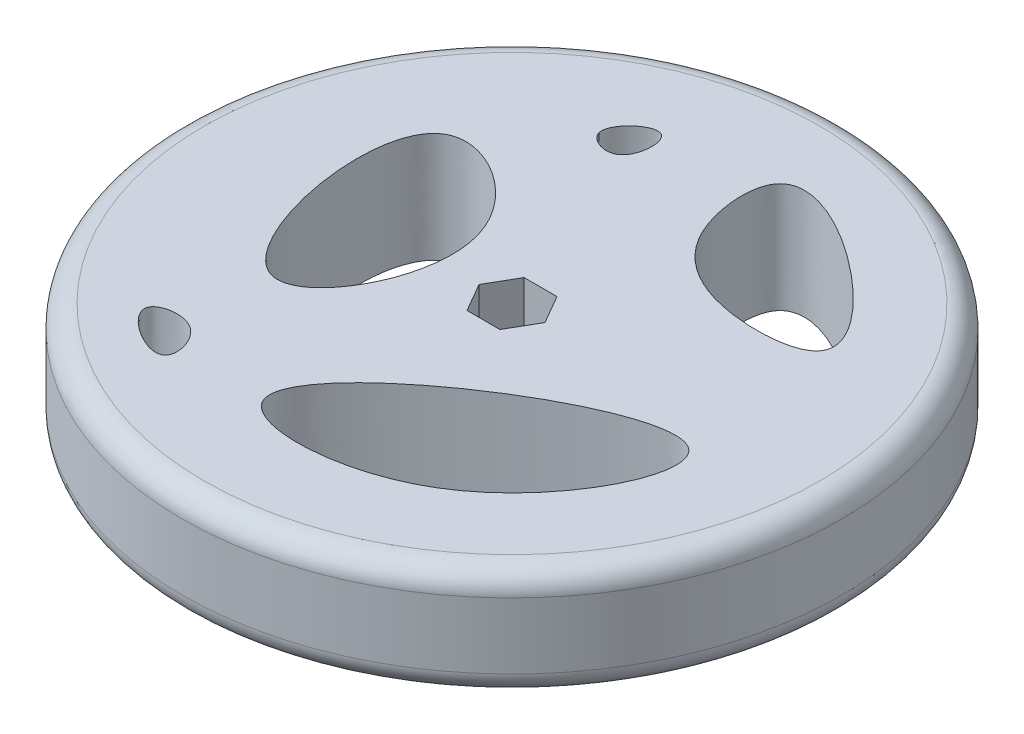
ISO-10303-21;
HEADER;
FILE_DESCRIPTION(('STEP AP214'),'2;1');
FILE_NAME('part.step','',(''),(''),'','','');
FILE_SCHEMA(('AUTOMOTIVE_DESIGN { 1 0 10303 214 1 1 1 1 }'));
ENDSEC;
DATA;
#1=APPLICATION_CONTEXT('core data for automotive mechanical design processes');
#2=APPLICATION_PROTOCOL_DEFINITION('international standard','automotive_design',2000,#1);
#3=PRODUCT_CONTEXT('',#1,'mechanical');
#4=PRODUCT('Part','Part','',(#3));
#5=PRODUCT_RELATED_PRODUCT_CATEGORY('part','',(#4));
#6=PRODUCT_DEFINITION_FORMATION('','',#4);
#7=PRODUCT_DEFINITION_CONTEXT('part definition',#1,'design');
#8=PRODUCT_DEFINITION('design','',#6,#7);
#9=PRODUCT_DEFINITION_SHAPE('','',#8);
#10=(LENGTH_UNIT() NAMED_UNIT(*) SI_UNIT(.MILLI.,.METRE.));
#11=(NAMED_UNIT(*) PLANE_ANGLE_UNIT() SI_UNIT($,.RADIAN.));
#12=(NAMED_UNIT(*) SI_UNIT($,.STERADIAN.) SOLID_ANGLE_UNIT());
#13=UNCERTAINTY_MEASURE_WITH_UNIT(LENGTH_MEASURE(1.E-05),#10,'distance_accuracy_value','');
#14=(GEOMETRIC_REPRESENTATION_CONTEXT(3) GLOBAL_UNCERTAINTY_ASSIGNED_CONTEXT((#13)) GLOBAL_UNIT_ASSIGNED_CONTEXT((#10,
#11,#12)) REPRESENTATION_CONTEXT('',''));
#15=CARTESIAN_POINT('',(0.,0.,0.));
#16=DIRECTION('',(0.,0.,1.));
#17=DIRECTION('',(1.,0.,0.));
#18=AXIS2_PLACEMENT_3D('',#15,#16,#17);
#19=CARTESIAN_POINT('',(0.,10.,0.));
#20=DIRECTION('',(0.,-1.,0.));
#21=DIRECTION('',(0.,0.,-1.));
#22=AXIS2_PLACEMENT_3D('',#19,#20,#21);
#23=CYLINDRICAL_SURFACE('',#22,30.);
#24=CARTESIAN_POINT('',(0.,2.,0.));
#25=DIRECTION('',(0.,1.,0.));
#26=DIRECTION('',(0.,0.,1.));
#27=AXIS2_PLACEMENT_3D('',#24,#25,#26);
#28=CIRCLE('',#27,30.);
#29=CARTESIAN_POINT('',(0.,2.,30.));
#30=VERTEX_POINT('',#29);
#31=EDGE_CURVE('E167',#30,#30,#28,.T.);
#32=ORIENTED_EDGE('',*,*,#31,.T.);
#33=EDGE_LOOP('',(#32));
#34=FACE_BOUND('',#33,.T.);
#35=CARTESIAN_POINT('',(0.,8.,0.));
#36=DIRECTION('',(0.,1.,0.));
#37=DIRECTION('',(0.,0.,1.));
#38=AXIS2_PLACEMENT_3D('',#35,#36,#37);
#39=CIRCLE('',#38,30.);
#40=CARTESIAN_POINT('',(0.,8.,30.));
#41=VERTEX_POINT('',#40);
#42=EDGE_CURVE('E154',#41,#41,#39,.F.);
#43=ORIENTED_EDGE('',*,*,#42,.T.);
#44=EDGE_LOOP('',(#43));
#45=FACE_BOUND('',#44,.T.);
#46=ADVANCED_FACE('F38',(#34,#45),#23,.T.);
#47=CARTESIAN_POINT('',(0.,10.,0.));
#48=DIRECTION('',(0.,1.,0.));
#49=DIRECTION('',(0.,0.,1.));
#50=AXIS2_PLACEMENT_3D('',#47,#48,#49);
#51=PLANE('',#50);
#52=CARTESIAN_POINT('',(-16.3077323631962,10.,16.9410423578834));
#53=CARTESIAN_POINT('',(-16.6735771523358,10.,18.2791187877496));
#54=CARTESIAN_POINT('',(-10.2758726246276,10.,22.4101693825931));
#55=CARTESIAN_POINT('',(-12.0859295567831,10.,15.2922923422462));
#56=CARTESIAN_POINT('',(-16.07380638128,10.,16.0854586458083));
#57=CARTESIAN_POINT('',(-16.3077323631962,10.,16.9410423578834));
#58=B_SPLINE_CURVE_WITH_KNOTS('',3,(#52,#53,#54,#55,#56,#57),.UNSPECIFIED.,.T.,.F.,(4,1,1,4),
(0.,0.433835950993369,0.722599572716709,1.),.UNSPECIFIED.);
#59=CARTESIAN_POINT('',(-16.3077323631962,10.,16.9410423578834));
#60=VERTEX_POINT('',#59);
#61=EDGE_CURVE('E346',#60,#60,#58,.T.);
#62=ORIENTED_EDGE('',*,*,#61,.F.);
#63=EDGE_LOOP('',(#62));
#64=FACE_BOUND('',#63,.T.);
#65=CARTESIAN_POINT('',(-9.49964992030849,10.,-17.4160248538989));
#66=CARTESIAN_POINT('',(-9.25958002758559,10.,-16.58115238073));
#67=CARTESIAN_POINT('',(-5.94384862705972,10.,-15.3299687735034));
#68=CARTESIAN_POINT('',(-5.51405951275125,10.,-22.4742475980582));
#69=CARTESIAN_POINT('',(-9.86321393666362,10.,-18.6803632765431));
#70=CARTESIAN_POINT('',(-9.49964992030849,10.,-17.4160248538989));
#71=B_SPLINE_CURVE_WITH_KNOTS('',3,(#65,#66,#67,#68,#69,#70),.UNSPECIFIED.,.T.,.F.,(4,1,1,4),
(0.,0.256133797884744,0.612108660411026,1.),.UNSPECIFIED.);
#72=CARTESIAN_POINT('',(-9.49964992030849,10.,-17.4160248538989));
#73=VERTEX_POINT('',#72);
#74=EDGE_CURVE('E325',#73,#73,#71,.T.);
#75=ORIENTED_EDGE('',*,*,#74,.F.);
#76=EDGE_LOOP('',(#75));
#77=FACE_BOUND('',#76,.T.);
#78=CARTESIAN_POINT('',(2.53323997874894,10.,-21.3742123206941));
#79=CARTESIAN_POINT('',(1.70265038006093,10.,-20.1655951738517));
#80=CARTESIAN_POINT('',(2.09284828980043,10.,-13.2992278627383));
#81=CARTESIAN_POINT('',(8.37687450416671,10.,-8.47820416104133));
#82=CARTESIAN_POINT('',(21.3583902693296,10.,-9.19933563935711));
#83=CARTESIAN_POINT('',(12.8306691146007,10.,-19.2524179955214));
#84=CARTESIAN_POINT('',(4.02417516002154,10.,-23.5437191719274));
#85=CARTESIAN_POINT('',(2.53323997874894,10.,-21.3742123206941));
#86=B_SPLINE_CURVE_WITH_KNOTS('',3,(#78,#79,#80,#81,#82,#83,#84,#85),.UNSPECIFIED.,.T.,.F.,(4,1,
1,1,1,4),(0.,0.135142659023725,0.359152997127321,0.539614474885721,0.757414558107313,1.),.UNSPECIFIED.);
#87=CARTESIAN_POINT('',(2.53323997874894,10.,-21.3742123206941));
#88=VERTEX_POINT('',#87);
#89=EDGE_CURVE('E303',#88,#88,#86,.T.);
#90=ORIENTED_EDGE('',*,*,#89,.F.);
#91=EDGE_LOOP('',(#90));
#92=FACE_BOUND('',#91,.T.);
#93=CARTESIAN_POINT('',(11.030149074136,10.,17.9965590156955));
#94=CARTESIAN_POINT('',(17.6980597758193,10.,14.0291163615398));
#95=CARTESIAN_POINT('',(28.8010194235829,10.,-8.46764940368874));
#96=CARTESIAN_POINT('',(-17.2462637420447,10.,21.5511041513703));
#97=CARTESIAN_POINT('',(5.18931431879517,10.,21.4718870428636));
#98=CARTESIAN_POINT('',(11.030149074136,10.,17.9965590156955));
#99=B_SPLINE_CURVE_WITH_KNOTS('',3,(#93,#94,#95,#96,#97,#98),.UNSPECIFIED.,.T.,.F.,(4,1,1,4),
(0.,0.282898463550659,0.752191765597273,1.),.UNSPECIFIED.);
#100=CARTESIAN_POINT('',(11.030149074136,10.,17.9965590156955));
#101=VERTEX_POINT('',#100);
#102=EDGE_CURVE('E285',#101,#101,#99,.T.);
#103=ORIENTED_EDGE('',*,*,#102,.F.);
#104=EDGE_LOOP('',(#103));
#105=FACE_BOUND('',#104,.T.);
#106=CARTESIAN_POINT('',(-16.3077323631962,10.,-10.3440632465582));
#107=CARTESIAN_POINT('',(-20.858304807785,10.,-7.95530457111899));
#108=CARTESIAN_POINT('',(-15.2474615246145,10.,19.7860835033411));
#109=CARTESIAN_POINT('',(-1.86899315016016,10.,-4.53382459443227));
#110=CARTESIAN_POINT('',(-13.6790794952249,10.,-11.7239374095443));
#111=CARTESIAN_POINT('',(-16.3077323631962,10.,-10.3440632465582));
#112=B_SPLINE_CURVE_WITH_KNOTS('',3,(#106,#107,#108,#109,#110,#111),.UNSPECIFIED.,.T.,.F.,(4,1,
1,4),(0.,0.43402314677192,0.749285127658034,1.),.UNSPECIFIED.);
#113=CARTESIAN_POINT('',(-16.3077323631962,10.,-10.3440632465582));
#114=VERTEX_POINT('',#113);
#115=EDGE_CURVE('E210',#114,#114,#112,.T.);
#116=ORIENTED_EDGE('',*,*,#115,.F.);
#117=EDGE_LOOP('',(#116));
#118=FACE_BOUND('',#117,.T.);
#119=CARTESIAN_POINT('',(0.,10.,0.));
#120=DIRECTION('',(0.,1.,0.));
#121=DIRECTION('',(0.,0.,1.));
#122=AXIS2_PLACEMENT_3D('',#119,#120,#121);
#123=CIRCLE('',#122,28.);
#124=CARTESIAN_POINT('',(0.,10.,28.));
#125=VERTEX_POINT('',#124);
#126=EDGE_CURVE('E11',#125,#125,#123,.T.);
#127=ORIENTED_EDGE('',*,*,#126,.T.);
#128=EDGE_LOOP('',(#127));
#129=FACE_BOUND('',#128,.T.);
#130=DIRECTION('',(1.,0.,0.));
#131=VECTOR('',#130,1.);
#132=CARTESIAN_POINT('',(-1.5,10.,2.59807621135332));
#133=LINE('',#132,#131);
#134=CARTESIAN_POINT('',(-1.5,10.,2.59807621135332));
#135=VERTEX_POINT('',#134);
#136=CARTESIAN_POINT('',(1.5,10.,2.59807621135332));
#137=VERTEX_POINT('',#136);
#138=EDGE_CURVE('E54',#135,#137,#133,.T.);
#139=ORIENTED_EDGE('',*,*,#138,.F.);
#140=DIRECTION('',(0.5,0.,0.866025403784439));
#141=VECTOR('',#140,1.);
#142=CARTESIAN_POINT('',(-3.,10.,0.));
#143=LINE('',#142,#141);
#144=CARTESIAN_POINT('',(-3.,10.,0.));
#145=VERTEX_POINT('',#144);
#146=EDGE_CURVE('E148',#145,#135,#143,.T.);
#147=ORIENTED_EDGE('',*,*,#146,.F.);
#148=DIRECTION('',(-0.5,0.,0.866025403784439));
#149=VECTOR('',#148,1.);
#150=CARTESIAN_POINT('',(-1.5,10.,-2.59807621135332));
#151=LINE('',#150,#149);
#152=CARTESIAN_POINT('',(-1.5,10.,-2.59807621135332));
#153=VERTEX_POINT('',#152);
#154=EDGE_CURVE('E145',#153,#145,#151,.T.);
#155=ORIENTED_EDGE('',*,*,#154,.F.);
#156=DIRECTION('',(-1.,0.,0.));
#157=VECTOR('',#156,1.);
#158=CARTESIAN_POINT('',(1.5,10.,-2.59807621135332));
#159=LINE('',#158,#157);
#160=CARTESIAN_POINT('',(1.5,10.,-2.59807621135332));
#161=VERTEX_POINT('',#160);
#162=EDGE_CURVE('E102',#161,#153,#159,.T.);
#163=ORIENTED_EDGE('',*,*,#162,.F.);
#164=DIRECTION('',(-0.5,0.,-0.866025403784439));
#165=VECTOR('',#164,1.);
#166=CARTESIAN_POINT('',(3.,10.,0.));
#167=LINE('',#166,#165);
#168=CARTESIAN_POINT('',(3.,10.,0.));
#169=VERTEX_POINT('',#168);
#170=EDGE_CURVE('E139',#169,#161,#167,.T.);
#171=ORIENTED_EDGE('',*,*,#170,.F.);
#172=DIRECTION('',(0.5,0.,-0.866025403784439));
#173=VECTOR('',#172,1.);
#174=CARTESIAN_POINT('',(1.5,10.,2.59807621135332));
#175=LINE('',#174,#173);
#176=EDGE_CURVE('E134',#137,#169,#175,.T.);
#177=ORIENTED_EDGE('',*,*,#176,.F.);
#178=EDGE_LOOP('',(#139,#147,#155,#163,#171,#177));
#179=FACE_BOUND('',#178,.T.);
#180=ADVANCED_FACE('F183',(#64,#77,#92,#105,#118,#129,#179),#51,.T.);
#181=CARTESIAN_POINT('',(0.,0.,0.));
#182=DIRECTION('',(0.,1.,0.));
#183=DIRECTION('',(0.,0.,1.));
#184=AXIS2_PLACEMENT_3D('',#181,#182,#183);
#185=PLANE('',#184);
#186=CARTESIAN_POINT('',(-16.3077323631962,0.,16.9410423578834));
#187=CARTESIAN_POINT('',(-16.6735771523358,0.,18.2791187877496));
#188=CARTESIAN_POINT('',(-10.2758726246276,0.,22.4101693825931));
#189=CARTESIAN_POINT('',(-12.0859295567831,0.,15.2922923422462));
#190=CARTESIAN_POINT('',(-16.07380638128,0.,16.0854586458083));
#191=CARTESIAN_POINT('',(-16.3077323631962,0.,16.9410423578834));
#192=B_SPLINE_CURVE_WITH_KNOTS('',3,(#186,#187,#188,#189,#190,#191),.UNSPECIFIED.,.T.,.F.,(4,1,
1,4),(0.,0.433835950993369,0.722599572716709,1.),.UNSPECIFIED.);
#193=CARTESIAN_POINT('',(-16.3077323631962,0.,16.9410423578834));
#194=VERTEX_POINT('',#193);
#195=EDGE_CURVE('E227',#194,#194,#192,.F.);
#196=ORIENTED_EDGE('',*,*,#195,.F.);
#197=EDGE_LOOP('',(#196));
#198=FACE_BOUND('',#197,.T.);
#199=CARTESIAN_POINT('',(-9.49964992030849,0.,-17.4160248538989));
#200=CARTESIAN_POINT('',(-9.25958002758559,0.,-16.58115238073));
#201=CARTESIAN_POINT('',(-5.94384862705972,0.,-15.3299687735034));
#202=CARTESIAN_POINT('',(-5.51405951275125,0.,-22.4742475980582));
#203=CARTESIAN_POINT('',(-9.86321393666362,0.,-18.6803632765431));
#204=CARTESIAN_POINT('',(-9.49964992030849,0.,-17.4160248538989));
#205=B_SPLINE_CURVE_WITH_KNOTS('',3,(#199,#200,#201,#202,#203,#204),.UNSPECIFIED.,.T.,.F.,(4,1,
1,4),(0.,0.256133797884744,0.612108660411026,1.),.UNSPECIFIED.);
#206=CARTESIAN_POINT('',(-9.49964992030849,0.,-17.4160248538989));
#207=VERTEX_POINT('',#206);
#208=EDGE_CURVE('E271',#207,#207,#205,.F.);
#209=ORIENTED_EDGE('',*,*,#208,.F.);
#210=EDGE_LOOP('',(#209));
#211=FACE_BOUND('',#210,.T.);
#212=CARTESIAN_POINT('',(2.53323997874894,0.,-21.3742123206941));
#213=CARTESIAN_POINT('',(1.70265038006093,0.,-20.1655951738517));
#214=CARTESIAN_POINT('',(2.09284828980043,0.,-13.2992278627383));
#215=CARTESIAN_POINT('',(8.37687450416671,0.,-8.47820416104133));
#216=CARTESIAN_POINT('',(21.3583902693296,0.,-9.19933563935711));
#217=CARTESIAN_POINT('',(12.8306691146007,0.,-19.2524179955214));
#218=CARTESIAN_POINT('',(4.02417516002154,0.,-23.5437191719274));
#219=CARTESIAN_POINT('',(2.53323997874894,0.,-21.3742123206941));
#220=B_SPLINE_CURVE_WITH_KNOTS('',3,(#212,#213,#214,#215,#216,#217,#218,#219),.UNSPECIFIED.,.T.,
.F.,(4,1,1,1,1,4),(0.,0.135142659023725,0.359152997127321,0.539614474885721,0.757414558107313,
1.),.UNSPECIFIED.);
#221=CARTESIAN_POINT('',(2.53323997874894,0.,-21.3742123206941));
#222=VERTEX_POINT('',#221);
#223=EDGE_CURVE('E275',#222,#222,#220,.F.);
#224=ORIENTED_EDGE('',*,*,#223,.F.);
#225=EDGE_LOOP('',(#224));
#226=FACE_BOUND('',#225,.T.);
#227=CARTESIAN_POINT('',(11.030149074136,0.,17.9965590156955));
#228=CARTESIAN_POINT('',(17.6980597758193,0.,14.0291163615398));
#229=CARTESIAN_POINT('',(28.8010194235829,0.,-8.46764940368874));
#230=CARTESIAN_POINT('',(-17.2462637420447,0.,21.5511041513703));
#231=CARTESIAN_POINT('',(5.18931431879517,0.,21.4718870428636));
#232=CARTESIAN_POINT('',(11.030149074136,0.,17.9965590156955));
#233=B_SPLINE_CURVE_WITH_KNOTS('',3,(#227,#228,#229,#230,#231,#232),.UNSPECIFIED.,.T.,.F.,(4,1,
1,4),(0.,0.282898463550659,0.752191765597273,1.),.UNSPECIFIED.);
#234=CARTESIAN_POINT('',(11.030149074136,0.,17.9965590156955));
#235=VERTEX_POINT('',#234);
#236=EDGE_CURVE('E219',#235,#235,#233,.F.);
#237=ORIENTED_EDGE('',*,*,#236,.F.);
#238=EDGE_LOOP('',(#237));
#239=FACE_BOUND('',#238,.T.);
#240=CARTESIAN_POINT('',(-16.3077323631962,0.,-10.3440632465582));
#241=CARTESIAN_POINT('',(-20.858304807785,0.,-7.95530457111899));
#242=CARTESIAN_POINT('',(-15.2474615246145,0.,19.7860835033411));
#243=CARTESIAN_POINT('',(-1.86899315016016,0.,-4.53382459443227));
#244=CARTESIAN_POINT('',(-13.6790794952249,0.,-11.7239374095443));
#245=CARTESIAN_POINT('',(-16.3077323631962,0.,-10.3440632465582));
#246=B_SPLINE_CURVE_WITH_KNOTS('',3,(#240,#241,#242,#243,#244,#245),.UNSPECIFIED.,.T.,.F.,(4,1,
1,4),(0.,0.43402314677192,0.749285127658034,1.),.UNSPECIFIED.);
#247=CARTESIAN_POINT('',(-16.3077323631962,0.,-10.3440632465582));
#248=VERTEX_POINT('',#247);
#249=EDGE_CURVE('E135',#248,#248,#246,.F.);
#250=ORIENTED_EDGE('',*,*,#249,.F.);
#251=EDGE_LOOP('',(#250));
#252=FACE_BOUND('',#251,.T.);
#253=CARTESIAN_POINT('',(0.,0.,0.));
#254=DIRECTION('',(0.,1.,0.));
#255=DIRECTION('',(0.,0.,1.));
#256=AXIS2_PLACEMENT_3D('',#253,#254,#255);
#257=CIRCLE('',#256,28.);
#258=CARTESIAN_POINT('',(0.,0.,28.));
#259=VERTEX_POINT('',#258);
#260=EDGE_CURVE('E47',#259,#259,#257,.F.);
#261=ORIENTED_EDGE('',*,*,#260,.T.);
#262=EDGE_LOOP('',(#261));
#263=FACE_BOUND('',#262,.T.);
#264=ADVANCED_FACE('F174',(#198,#211,#226,#239,#252,#263),#185,.F.);
#265=CARTESIAN_POINT('',(-1.5,3.,2.59807621135332));
#266=DIRECTION('',(0.,0.,1.));
#267=DIRECTION('',(1.,0.,0.));
#268=AXIS2_PLACEMENT_3D('',#265,#266,#267);
#269=PLANE('',#268);
#270=ORIENTED_EDGE('',*,*,#138,.T.);
#271=DIRECTION('',(0.,1.,0.));
#272=VECTOR('',#271,1.);
#273=CARTESIAN_POINT('',(1.5,3.,2.59807621135332));
#274=LINE('',#273,#272);
#275=CARTESIAN_POINT('',(1.5,3.,2.59807621135332));
#276=VERTEX_POINT('',#275);
#277=EDGE_CURVE('E84',#276,#137,#274,.T.);
#278=ORIENTED_EDGE('',*,*,#277,.F.);
#279=DIRECTION('',(1.,0.,0.));
#280=VECTOR('',#279,1.);
#281=CARTESIAN_POINT('',(-1.5,3.,2.59807621135332));
#282=LINE('',#281,#280);
#283=CARTESIAN_POINT('',(-1.5,3.,2.59807621135332));
#284=VERTEX_POINT('',#283);
#285=EDGE_CURVE('E151',#284,#276,#282,.T.);
#286=ORIENTED_EDGE('',*,*,#285,.F.);
#287=DIRECTION('',(0.,1.,0.));
#288=VECTOR('',#287,1.);
#289=CARTESIAN_POINT('',(-1.5,3.,2.59807621135332));
#290=LINE('',#289,#288);
#291=EDGE_CURVE('E62',#284,#135,#290,.T.);
#292=ORIENTED_EDGE('',*,*,#291,.T.);
#293=EDGE_LOOP('',(#270,#278,#286,#292));
#294=FACE_BOUND('',#293,.T.);
#295=ADVANCED_FACE('F248',(#294),#269,.F.);
#296=CARTESIAN_POINT('',(-3.,3.,0.));
#297=DIRECTION('',(-0.866025403784439,0.,0.5));
#298=DIRECTION('',(0.5,0.,0.866025403784439));
#299=AXIS2_PLACEMENT_3D('',#296,#297,#298);
#300=PLANE('',#299);
#301=ORIENTED_EDGE('',*,*,#146,.T.);
#302=ORIENTED_EDGE('',*,*,#291,.F.);
#303=DIRECTION('',(0.5,0.,0.866025403784439));
#304=VECTOR('',#303,1.);
#305=CARTESIAN_POINT('',(-3.,3.,0.));
#306=LINE('',#305,#304);
#307=CARTESIAN_POINT('',(-3.,3.,0.));
#308=VERTEX_POINT('',#307);
#309=EDGE_CURVE('E116',#308,#284,#306,.T.);
#310=ORIENTED_EDGE('',*,*,#309,.F.);
#311=DIRECTION('',(0.,1.,0.));
#312=VECTOR('',#311,1.);
#313=CARTESIAN_POINT('',(-3.,3.,0.));
#314=LINE('',#313,#312);
#315=EDGE_CURVE('E107',#308,#145,#314,.T.);
#316=ORIENTED_EDGE('',*,*,#315,.T.);
#317=EDGE_LOOP('',(#301,#302,#310,#316));
#318=FACE_BOUND('',#317,.T.);
#319=ADVANCED_FACE('F245',(#318),#300,.F.);
#320=CARTESIAN_POINT('',(-1.5,3.,-2.59807621135332));
#321=DIRECTION('',(-0.866025403784439,0.,-0.5));
#322=DIRECTION('',(-0.5,0.,0.866025403784439));
#323=AXIS2_PLACEMENT_3D('',#320,#321,#322);
#324=PLANE('',#323);
#325=ORIENTED_EDGE('',*,*,#154,.T.);
#326=ORIENTED_EDGE('',*,*,#315,.F.);
#327=DIRECTION('',(-0.5,0.,0.866025403784439));
#328=VECTOR('',#327,1.);
#329=CARTESIAN_POINT('',(-1.5,3.,-2.59807621135332));
#330=LINE('',#329,#328);
#331=CARTESIAN_POINT('',(-1.5,3.,-2.59807621135332));
#332=VERTEX_POINT('',#331);
#333=EDGE_CURVE('E111',#332,#308,#330,.T.);
#334=ORIENTED_EDGE('',*,*,#333,.F.);
#335=DIRECTION('',(0.,1.,0.));
#336=VECTOR('',#335,1.);
#337=CARTESIAN_POINT('',(-1.5,3.,-2.59807621135332));
#338=LINE('',#337,#336);
#339=EDGE_CURVE('E95',#332,#153,#338,.T.);
#340=ORIENTED_EDGE('',*,*,#339,.T.);
#341=EDGE_LOOP('',(#325,#326,#334,#340));
#342=FACE_BOUND('',#341,.T.);
#343=ADVANCED_FACE('F112',(#342),#324,.F.);
#344=CARTESIAN_POINT('',(1.5,3.,-2.59807621135332));
#345=DIRECTION('',(0.,0.,-1.));
#346=DIRECTION('',(-1.,0.,0.));
#347=AXIS2_PLACEMENT_3D('',#344,#345,#346);
#348=PLANE('',#347);
#349=ORIENTED_EDGE('',*,*,#162,.T.);
#350=ORIENTED_EDGE('',*,*,#339,.F.);
#351=DIRECTION('',(-1.,0.,0.));
#352=VECTOR('',#351,1.);
#353=CARTESIAN_POINT('',(1.5,3.,-2.59807621135332));
#354=LINE('',#353,#352);
#355=CARTESIAN_POINT('',(1.5,3.,-2.59807621135332));
#356=VERTEX_POINT('',#355);
#357=EDGE_CURVE('E99',#356,#332,#354,.T.);
#358=ORIENTED_EDGE('',*,*,#357,.F.);
#359=DIRECTION('',(0.,1.,0.));
#360=VECTOR('',#359,1.);
#361=CARTESIAN_POINT('',(1.5,3.,-2.59807621135332));
#362=LINE('',#361,#360);
#363=EDGE_CURVE('E108',#356,#161,#362,.T.);
#364=ORIENTED_EDGE('',*,*,#363,.T.);
#365=EDGE_LOOP('',(#349,#350,#358,#364));
#366=FACE_BOUND('',#365,.T.);
#367=ADVANCED_FACE('F97',(#366),#348,.F.);
#368=CARTESIAN_POINT('',(3.,3.,0.));
#369=DIRECTION('',(0.866025403784439,0.,-0.5));
#370=DIRECTION('',(-0.5,0.,-0.866025403784439));
#371=AXIS2_PLACEMENT_3D('',#368,#369,#370);
#372=PLANE('',#371);
#373=ORIENTED_EDGE('',*,*,#170,.T.);
#374=ORIENTED_EDGE('',*,*,#363,.F.);
#375=DIRECTION('',(-0.5,0.,-0.866025403784439));
#376=VECTOR('',#375,1.);
#377=CARTESIAN_POINT('',(3.,3.,0.));
#378=LINE('',#377,#376);
#379=CARTESIAN_POINT('',(3.,3.,0.));
#380=VERTEX_POINT('',#379);
#381=EDGE_CURVE('E122',#380,#356,#378,.T.);
#382=ORIENTED_EDGE('',*,*,#381,.F.);
#383=DIRECTION('',(0.,1.,0.));
#384=VECTOR('',#383,1.);
#385=CARTESIAN_POINT('',(3.,3.,0.));
#386=LINE('',#385,#384);
#387=EDGE_CURVE('E159',#380,#169,#386,.T.);
#388=ORIENTED_EDGE('',*,*,#387,.T.);
#389=EDGE_LOOP('',(#373,#374,#382,#388));
#390=FACE_BOUND('',#389,.T.);
#391=ADVANCED_FACE('F253',(#390),#372,.F.);
#392=CARTESIAN_POINT('',(1.5,3.,2.59807621135332));
#393=DIRECTION('',(0.866025403784439,0.,0.5));
#394=DIRECTION('',(0.5,0.,-0.866025403784439));
#395=AXIS2_PLACEMENT_3D('',#392,#393,#394);
#396=PLANE('',#395);
#397=ORIENTED_EDGE('',*,*,#176,.T.);
#398=ORIENTED_EDGE('',*,*,#387,.F.);
#399=DIRECTION('',(0.5,0.,-0.866025403784439));
#400=VECTOR('',#399,1.);
#401=CARTESIAN_POINT('',(1.5,3.,2.59807621135332));
#402=LINE('',#401,#400);
#403=EDGE_CURVE('E126',#276,#380,#402,.T.);
#404=ORIENTED_EDGE('',*,*,#403,.F.);
#405=ORIENTED_EDGE('',*,*,#277,.T.);
#406=EDGE_LOOP('',(#397,#398,#404,#405));
#407=FACE_BOUND('',#406,.T.);
#408=ADVANCED_FACE('F200',(#407),#396,.F.);
#409=CARTESIAN_POINT('',(0.,3.,0.));
#410=DIRECTION('',(0.,1.,0.));
#411=DIRECTION('',(0.,0.,1.));
#412=AXIS2_PLACEMENT_3D('',#409,#410,#411);
#413=PLANE('',#412);
#414=ORIENTED_EDGE('',*,*,#285,.T.);
#415=ORIENTED_EDGE('',*,*,#403,.T.);
#416=ORIENTED_EDGE('',*,*,#381,.T.);
#417=ORIENTED_EDGE('',*,*,#357,.T.);
#418=ORIENTED_EDGE('',*,*,#333,.T.);
#419=ORIENTED_EDGE('',*,*,#309,.T.);
#420=EDGE_LOOP('',(#414,#415,#416,#417,#418,#419));
#421=FACE_BOUND('',#420,.T.);
#422=ADVANCED_FACE('F119',(#421),#413,.T.);
#423=CARTESIAN_POINT('',(0.,2.,0.));
#424=DIRECTION('',(0.,1.,0.));
#425=DIRECTION('',(0.,0.,1.));
#426=AXIS2_PLACEMENT_3D('',#423,#424,#425);
#427=TOROIDAL_SURFACE('',#426,28.,2.);
#428=ORIENTED_EDGE('',*,*,#260,.F.);
#429=EDGE_LOOP('',(#428));
#430=FACE_BOUND('',#429,.T.);
#431=ORIENTED_EDGE('',*,*,#31,.F.);
#432=EDGE_LOOP('',(#431));
#433=FACE_BOUND('',#432,.T.);
#434=ADVANCED_FACE('F176',(#430,#433),#427,.T.);
#435=CARTESIAN_POINT('',(0.,8.,0.));
#436=DIRECTION('',(0.,1.,0.));
#437=DIRECTION('',(0.,0.,1.));
#438=AXIS2_PLACEMENT_3D('',#435,#436,#437);
#439=TOROIDAL_SURFACE('',#438,28.,2.);
#440=ORIENTED_EDGE('',*,*,#42,.F.);
#441=EDGE_LOOP('',(#440));
#442=FACE_BOUND('',#441,.T.);
#443=ORIENTED_EDGE('',*,*,#126,.F.);
#444=EDGE_LOOP('',(#443));
#445=FACE_BOUND('',#444,.T.);
#446=ADVANCED_FACE('F40',(#442,#445),#439,.T.);
#447=CARTESIAN_POINT('',(-16.3077323631962,-31.8535513656865,-10.3440632465582));
#448=CARTESIAN_POINT('',(-20.858304807785,-31.8535513656865,-7.95530457111899));
#449=CARTESIAN_POINT('',(-15.2474615246145,-31.8535513656865,19.7860835033411));
#450=CARTESIAN_POINT('',(-1.86899315016016,-31.8535513656865,-4.53382459443227));
#451=CARTESIAN_POINT('',(-13.6790794952249,-31.8535513656865,-11.7239374095443));
#452=CARTESIAN_POINT('',(-16.3077323631962,-31.8535513656865,-10.3440632465582));
#453=B_SPLINE_CURVE_WITH_KNOTS('',3,(#447,#448,#449,#450,#451,#452),.UNSPECIFIED.,.T.,.F.,(4,1,
1,4),(0.,0.43402314677192,0.749285127658034,1.),.UNSPECIFIED.);
#454=DIRECTION('',(0.,1.,0.));
#455=VECTOR('',#454,1.);
#456=SURFACE_OF_LINEAR_EXTRUSION('',#453,#455);
#457=ORIENTED_EDGE('',*,*,#249,.T.);
#458=EDGE_LOOP('',(#457));
#459=FACE_BOUND('',#458,.T.);
#460=ORIENTED_EDGE('',*,*,#115,.T.);
#461=EDGE_LOOP('',(#460));
#462=FACE_BOUND('',#461,.T.);
#463=ADVANCED_FACE('F189',(#459,#462),#456,.F.);
#464=CARTESIAN_POINT('',(11.030149074136,-31.8535513656865,17.9965590156955));
#465=CARTESIAN_POINT('',(17.6980597758193,-31.8535513656865,14.0291163615398));
#466=CARTESIAN_POINT('',(28.8010194235829,-31.8535513656865,-8.46764940368874));
#467=CARTESIAN_POINT('',(-17.2462637420447,-31.8535513656865,21.5511041513703));
#468=CARTESIAN_POINT('',(5.18931431879517,-31.8535513656865,21.4718870428636));
#469=CARTESIAN_POINT('',(11.030149074136,-31.8535513656865,17.9965590156955));
#470=B_SPLINE_CURVE_WITH_KNOTS('',3,(#464,#465,#466,#467,#468,#469),.UNSPECIFIED.,.T.,.F.,(4,1,
1,4),(0.,0.282898463550659,0.752191765597273,1.),.UNSPECIFIED.);
#471=DIRECTION('',(0.,1.,0.));
#472=VECTOR('',#471,1.);
#473=SURFACE_OF_LINEAR_EXTRUSION('',#470,#472);
#474=ORIENTED_EDGE('',*,*,#236,.T.);
#475=EDGE_LOOP('',(#474));
#476=FACE_BOUND('',#475,.T.);
#477=ORIENTED_EDGE('',*,*,#102,.T.);
#478=EDGE_LOOP('',(#477));
#479=FACE_BOUND('',#478,.T.);
#480=ADVANCED_FACE('F238',(#476,#479),#473,.F.);
#481=CARTESIAN_POINT('',(2.53323997874894,-31.8535513656865,-21.3742123206941));
#482=CARTESIAN_POINT('',(1.70265038006093,-31.8535513656865,-20.1655951738517));
#483=CARTESIAN_POINT('',(2.09284828980043,-31.8535513656865,-13.2992278627383));
#484=CARTESIAN_POINT('',(8.37687450416671,-31.8535513656865,-8.47820416104133));
#485=CARTESIAN_POINT('',(21.3583902693296,-31.8535513656865,-9.19933563935711));
#486=CARTESIAN_POINT('',(12.8306691146007,-31.8535513656865,-19.2524179955214));
#487=CARTESIAN_POINT('',(4.02417516002154,-31.8535513656865,-23.5437191719274));
#488=CARTESIAN_POINT('',(2.53323997874894,-31.8535513656865,-21.3742123206941));
#489=B_SPLINE_CURVE_WITH_KNOTS('',3,(#481,#482,#483,#484,#485,#486,#487,#488),.UNSPECIFIED.,.T.,
.F.,(4,1,1,1,1,4),(0.,0.135142659023725,0.359152997127321,0.539614474885721,0.757414558107313,
1.),.UNSPECIFIED.);
#490=DIRECTION('',(0.,1.,0.));
#491=VECTOR('',#490,1.);
#492=SURFACE_OF_LINEAR_EXTRUSION('',#489,#491);
#493=ORIENTED_EDGE('',*,*,#223,.T.);
#494=EDGE_LOOP('',(#493));
#495=FACE_BOUND('',#494,.T.);
#496=ORIENTED_EDGE('',*,*,#89,.T.);
#497=EDGE_LOOP('',(#496));
#498=FACE_BOUND('',#497,.T.);
#499=ADVANCED_FACE('F311',(#495,#498),#492,.F.);
#500=CARTESIAN_POINT('',(-9.49964992030849,-31.8535513656865,-17.4160248538989));
#501=CARTESIAN_POINT('',(-9.25958002758559,-31.8535513656865,-16.58115238073));
#502=CARTESIAN_POINT('',(-5.94384862705972,-31.8535513656865,-15.3299687735034));
#503=CARTESIAN_POINT('',(-5.51405951275125,-31.8535513656865,-22.4742475980582));
#504=CARTESIAN_POINT('',(-9.86321393666362,-31.8535513656865,-18.6803632765431));
#505=CARTESIAN_POINT('',(-9.49964992030849,-31.8535513656865,-17.4160248538989));
#506=B_SPLINE_CURVE_WITH_KNOTS('',3,(#500,#501,#502,#503,#504,#505),.UNSPECIFIED.,.T.,.F.,(4,1,
1,4),(0.,0.256133797884744,0.612108660411026,1.),.UNSPECIFIED.);
#507=DIRECTION('',(0.,1.,0.));
#508=VECTOR('',#507,1.);
#509=SURFACE_OF_LINEAR_EXTRUSION('',#506,#508);
#510=ORIENTED_EDGE('',*,*,#208,.T.);
#511=EDGE_LOOP('',(#510));
#512=FACE_BOUND('',#511,.T.);
#513=ORIENTED_EDGE('',*,*,#74,.T.);
#514=EDGE_LOOP('',(#513));
#515=FACE_BOUND('',#514,.T.);
#516=ADVANCED_FACE('F314',(#512,#515),#509,.F.);
#517=CARTESIAN_POINT('',(-16.3077323631962,-31.8535513656865,16.9410423578834));
#518=CARTESIAN_POINT('',(-16.6735771523358,-31.8535513656865,18.2791187877496));
#519=CARTESIAN_POINT('',(-10.2758726246276,-31.8535513656865,22.4101693825931));
#520=CARTESIAN_POINT('',(-12.0859295567831,-31.8535513656865,15.2922923422462));
#521=CARTESIAN_POINT('',(-16.07380638128,-31.8535513656865,16.0854586458083));
#522=CARTESIAN_POINT('',(-16.3077323631962,-31.8535513656865,16.9410423578834));
#523=B_SPLINE_CURVE_WITH_KNOTS('',3,(#517,#518,#519,#520,#521,#522),.UNSPECIFIED.,.T.,.F.,(4,1,
1,4),(0.,0.433835950993369,0.722599572716709,1.),.UNSPECIFIED.);
#524=DIRECTION('',(0.,1.,0.));
#525=VECTOR('',#524,1.);
#526=SURFACE_OF_LINEAR_EXTRUSION('',#523,#525);
#527=ORIENTED_EDGE('',*,*,#195,.T.);
#528=EDGE_LOOP('',(#527));
#529=FACE_BOUND('',#528,.T.);
#530=ORIENTED_EDGE('',*,*,#61,.T.);
#531=EDGE_LOOP('',(#530));
#532=FACE_BOUND('',#531,.T.);
#533=ADVANCED_FACE('F240',(#529,#532),#526,.F.);
#534=CLOSED_SHELL('',(#46,#180,#264,#295,#319,#343,#367,#391,#408,#422,#434,#446,#463,#480,#499,
#516,#533));
#535=MANIFOLD_SOLID_BREP('B2',#534);
#536=ADVANCED_BREP_SHAPE_REPRESENTATION('',(#18,#535),#14);
#537=SHAPE_DEFINITION_REPRESENTATION(#9,#536);
ENDSEC;
END-ISO-10303-21;
